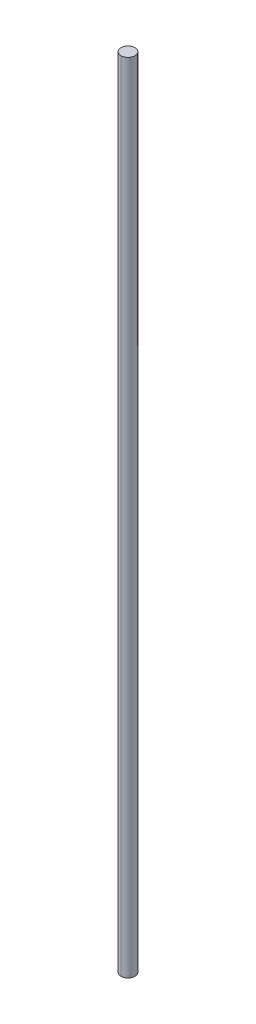
ISO-10303-21;
HEADER;
FILE_DESCRIPTION(('STEP AP214'),'2;1');
FILE_NAME('part.step','',(''),(''),'','','');
FILE_SCHEMA(('AUTOMOTIVE_DESIGN { 1 0 10303 214 1 1 1 1 }'));
ENDSEC;
DATA;
#1=APPLICATION_CONTEXT('core data for automotive mechanical design processes');
#2=APPLICATION_PROTOCOL_DEFINITION('international standard','automotive_design',2000,#1);
#3=PRODUCT_CONTEXT('',#1,'mechanical');
#4=PRODUCT('Part','Part','',(#3));
#5=PRODUCT_RELATED_PRODUCT_CATEGORY('part','',(#4));
#6=PRODUCT_DEFINITION_FORMATION('','',#4);
#7=PRODUCT_DEFINITION_CONTEXT('part definition',#1,'design');
#8=PRODUCT_DEFINITION('design','',#6,#7);
#9=PRODUCT_DEFINITION_SHAPE('','',#8);
#10=(LENGTH_UNIT() NAMED_UNIT(*) SI_UNIT(.MILLI.,.METRE.));
#11=(NAMED_UNIT(*) PLANE_ANGLE_UNIT() SI_UNIT($,.RADIAN.));
#12=(NAMED_UNIT(*) SI_UNIT($,.STERADIAN.) SOLID_ANGLE_UNIT());
#13=UNCERTAINTY_MEASURE_WITH_UNIT(LENGTH_MEASURE(1.E-05),#10,'distance_accuracy_value','');
#14=(GEOMETRIC_REPRESENTATION_CONTEXT(3) GLOBAL_UNCERTAINTY_ASSIGNED_CONTEXT((#13)) GLOBAL_UNIT_ASSIGNED_CONTEXT((#10,
#11,#12)) REPRESENTATION_CONTEXT('',''));
#15=CARTESIAN_POINT('',(0.,0.,0.));
#16=DIRECTION('',(0.,0.,1.));
#17=DIRECTION('',(1.,0.,0.));
#18=AXIS2_PLACEMENT_3D('',#15,#16,#17);
#19=CARTESIAN_POINT('',(0.,100.,0.));
#20=DIRECTION('',(0.,1.,0.));
#21=DIRECTION('',(0.,0.,1.));
#22=AXIS2_PLACEMENT_3D('',#19,#20,#21);
#23=PLANE('',#22);
#24=CARTESIAN_POINT('',(0.,100.,0.));
#25=DIRECTION('',(0.,-1.,0.));
#26=DIRECTION('',(0.,0.,-1.));
#27=AXIS2_PLACEMENT_3D('',#24,#25,#26);
#28=CIRCLE('',#27,0.875000000000001);
#29=CARTESIAN_POINT('',(0.,100.,-0.875000000000001));
#30=VERTEX_POINT('',#29);
#31=CARTESIAN_POINT('',(0.,100.,0.875000000000001));
#32=VERTEX_POINT('',#31);
#33=EDGE_CURVE('E44',#30,#32,#28,.T.);
#34=ORIENTED_EDGE('',*,*,#33,.F.);
#35=CARTESIAN_POINT('',(0.,100.,0.));
#36=DIRECTION('',(0.,-1.,0.));
#37=DIRECTION('',(0.,0.,-1.));
#38=AXIS2_PLACEMENT_3D('',#35,#36,#37);
#39=CIRCLE('',#38,0.875000000000001);
#40=EDGE_CURVE('E20',#32,#30,#39,.T.);
#41=ORIENTED_EDGE('',*,*,#40,.F.);
#42=EDGE_LOOP('',(#34,#41));
#43=FACE_BOUND('',#42,.T.);
#44=ADVANCED_FACE('F17',(#43),#23,.T.);
#45=CARTESIAN_POINT('',(0.,0.,0.));
#46=DIRECTION('',(0.,1.,0.));
#47=DIRECTION('',(0.,0.,1.));
#48=AXIS2_PLACEMENT_3D('',#45,#46,#47);
#49=PLANE('',#48);
#50=CARTESIAN_POINT('',(0.,0.,0.));
#51=DIRECTION('',(0.,-1.,0.));
#52=DIRECTION('',(0.,0.,-1.));
#53=AXIS2_PLACEMENT_3D('',#50,#51,#52);
#54=CIRCLE('',#53,0.875000000000001);
#55=CARTESIAN_POINT('',(0.,0.,0.875000000000001));
#56=VERTEX_POINT('',#55);
#57=CARTESIAN_POINT('',(0.,0.,-0.875000000000001));
#58=VERTEX_POINT('',#57);
#59=EDGE_CURVE('E26',#56,#58,#54,.F.);
#60=ORIENTED_EDGE('',*,*,#59,.F.);
#61=CARTESIAN_POINT('',(0.,0.,0.));
#62=DIRECTION('',(0.,-1.,0.));
#63=DIRECTION('',(0.,0.,-1.));
#64=AXIS2_PLACEMENT_3D('',#61,#62,#63);
#65=CIRCLE('',#64,0.875000000000001);
#66=EDGE_CURVE('E34',#58,#56,#65,.F.);
#67=ORIENTED_EDGE('',*,*,#66,.F.);
#68=EDGE_LOOP('',(#60,#67));
#69=FACE_BOUND('',#68,.T.);
#70=ADVANCED_FACE('F55',(#69),#49,.F.);
#71=CARTESIAN_POINT('',(0.,100.,0.));
#72=DIRECTION('',(0.,-1.,0.));
#73=DIRECTION('',(0.,0.,-1.));
#74=AXIS2_PLACEMENT_3D('',#71,#72,#73);
#75=CYLINDRICAL_SURFACE('',#74,0.875000000000001);
#76=DIRECTION('',(0.,-1.,0.));
#77=VECTOR('',#76,1.);
#78=CARTESIAN_POINT('',(0.,100.,-0.875000000000001));
#79=LINE('',#78,#77);
#80=EDGE_CURVE('E11',#58,#30,#79,.F.);
#81=ORIENTED_EDGE('',*,*,#80,.F.);
#82=ORIENTED_EDGE('',*,*,#66,.T.);
#83=DIRECTION('',(0.,-1.,0.));
#84=VECTOR('',#83,1.);
#85=CARTESIAN_POINT('',(0.,100.,0.875000000000001));
#86=LINE('',#85,#84);
#87=EDGE_CURVE('E47',#32,#56,#86,.T.);
#88=ORIENTED_EDGE('',*,*,#87,.F.);
#89=ORIENTED_EDGE('',*,*,#40,.T.);
#90=EDGE_LOOP('',(#81,#82,#88,#89));
#91=FACE_BOUND('',#90,.T.);
#92=ADVANCED_FACE('F50',(#91),#75,.T.);
#93=CARTESIAN_POINT('',(0.,100.,0.));
#94=DIRECTION('',(0.,-1.,0.));
#95=DIRECTION('',(0.,0.,-1.));
#96=AXIS2_PLACEMENT_3D('',#93,#94,#95);
#97=CYLINDRICAL_SURFACE('',#96,0.875000000000001);
#98=ORIENTED_EDGE('',*,*,#59,.T.);
#99=ORIENTED_EDGE('',*,*,#80,.T.);
#100=ORIENTED_EDGE('',*,*,#33,.T.);
#101=ORIENTED_EDGE('',*,*,#87,.T.);
#102=EDGE_LOOP('',(#98,#99,#100,#101));
#103=FACE_BOUND('',#102,.T.);
#104=ADVANCED_FACE('F52',(#103),#97,.T.);
#105=CLOSED_SHELL('',(#44,#70,#92,#104));
#106=MANIFOLD_SOLID_BREP('B1',#105);
#107=ADVANCED_BREP_SHAPE_REPRESENTATION('',(#18,#106),#14);
#108=SHAPE_DEFINITION_REPRESENTATION(#9,#107);
ENDSEC;
END-ISO-10303-21;
